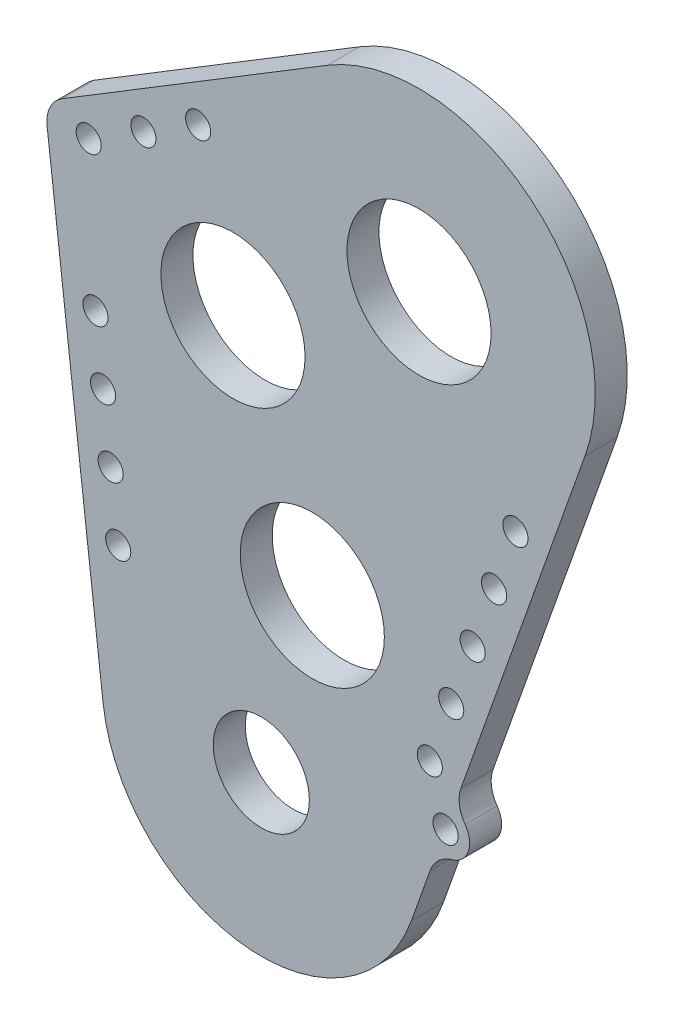
ISO-10303-21;
HEADER;
FILE_DESCRIPTION(('STEP AP214'),'2;1');
FILE_NAME('part.step','',(''),(''),'','','');
FILE_SCHEMA(('AUTOMOTIVE_DESIGN { 1 0 10303 214 1 1 1 1 }'));
ENDSEC;
DATA;
#1=APPLICATION_CONTEXT('core data for automotive mechanical design processes');
#2=APPLICATION_PROTOCOL_DEFINITION('international standard','automotive_design',2000,#1);
#3=PRODUCT_CONTEXT('',#1,'mechanical');
#4=PRODUCT('Part','Part','',(#3));
#5=PRODUCT_RELATED_PRODUCT_CATEGORY('part','',(#4));
#6=PRODUCT_DEFINITION_FORMATION('','',#4);
#7=PRODUCT_DEFINITION_CONTEXT('part definition',#1,'design');
#8=PRODUCT_DEFINITION('design','',#6,#7);
#9=PRODUCT_DEFINITION_SHAPE('','',#8);
#10=(LENGTH_UNIT() NAMED_UNIT(*) SI_UNIT(.MILLI.,.METRE.));
#11=(NAMED_UNIT(*) PLANE_ANGLE_UNIT() SI_UNIT($,.RADIAN.));
#12=(NAMED_UNIT(*) SI_UNIT($,.STERADIAN.) SOLID_ANGLE_UNIT());
#13=UNCERTAINTY_MEASURE_WITH_UNIT(LENGTH_MEASURE(1.E-05),#10,'distance_accuracy_value','');
#14=(GEOMETRIC_REPRESENTATION_CONTEXT(3) GLOBAL_UNCERTAINTY_ASSIGNED_CONTEXT((#13)) GLOBAL_UNIT_ASSIGNED_CONTEXT((#10,
#11,#12)) REPRESENTATION_CONTEXT('',''));
#15=CARTESIAN_POINT('',(0.,0.,0.));
#16=DIRECTION('',(0.,0.,1.));
#17=DIRECTION('',(1.,0.,0.));
#18=AXIS2_PLACEMENT_3D('',#15,#16,#17);
#19=CARTESIAN_POINT('',(287.62346504403,-102.053490711195,3.175));
#20=DIRECTION('',(0.942434404347901,-0.334391078680961,0.));
#21=DIRECTION('',(0.334391078680961,0.942434404347901,0.));
#22=AXIS2_PLACEMENT_3D('',#19,#20,#21);
#23=PLANE('',#22);
#24=DIRECTION('',(-0.334391078680961,-0.942434404347901,0.));
#25=VECTOR('',#24,1.);
#26=CARTESIAN_POINT('',(287.62346504403,-102.053490711195,3.175));
#27=LINE('',#26,#25);
#28=CARTESIAN_POINT('',(400.649449824626,216.494411531632,3.175));
#29=VERTEX_POINT('',#28);
#30=CARTESIAN_POINT('',(376.047742347887,147.157945908088,3.175));
#31=VERTEX_POINT('',#30);
#32=EDGE_CURVE('E123',#29,#31,#27,.T.);
#33=ORIENTED_EDGE('',*,*,#32,.T.);
#34=DIRECTION('',(0.,0.,-1.));
#35=VECTOR('',#34,1.);
#36=CARTESIAN_POINT('',(376.047742347887,147.157945908087,3.175));
#37=LINE('',#36,#35);
#38=CARTESIAN_POINT('',(376.047742347887,147.157945908088,-3.175));
#39=VERTEX_POINT('',#38);
#40=EDGE_CURVE('E293',#31,#39,#37,.T.);
#41=ORIENTED_EDGE('',*,*,#40,.T.);
#42=DIRECTION('',(-0.334391078680961,-0.942434404347901,0.));
#43=VECTOR('',#42,1.);
#44=CARTESIAN_POINT('',(287.62346504403,-102.053490711195,-3.175));
#45=LINE('',#44,#43);
#46=CARTESIAN_POINT('',(400.649449824626,216.494411531632,-3.175));
#47=VERTEX_POINT('',#46);
#48=EDGE_CURVE('E126',#47,#39,#45,.T.);
#49=ORIENTED_EDGE('',*,*,#48,.F.);
#50=DIRECTION('',(0.,0.,-1.));
#51=VECTOR('',#50,1.);
#52=CARTESIAN_POINT('',(400.649449824626,216.494411531632,3.175));
#53=LINE('',#52,#51);
#54=EDGE_CURVE('E119',#29,#47,#53,.T.);
#55=ORIENTED_EDGE('',*,*,#54,.F.);
#56=EDGE_LOOP('',(#33,#41,#49,#55));
#57=FACE_BOUND('',#56,.T.);
#58=ADVANCED_FACE('F41',(#57),#23,.T.);
#59=CARTESIAN_POINT('',(367.734928252776,228.173019954564,3.175));
#60=DIRECTION('',(0.,0.,-1.));
#61=DIRECTION('',(-1.,0.,0.));
#62=AXIS2_PLACEMENT_3D('',#59,#60,#61);
#63=CYLINDRICAL_SURFACE('',#62,34.925);
#64=CARTESIAN_POINT('',(367.734928252776,228.173019954564,-3.175));
#65=DIRECTION('',(0.,0.,1.));
#66=DIRECTION('',(1.,0.,0.));
#67=AXIS2_PLACEMENT_3D('',#64,#65,#66);
#68=CIRCLE('',#67,34.925);
#69=CARTESIAN_POINT('',(349.565627555219,257.999721702524,-3.175));
#70=VERTEX_POINT('',#69);
#71=EDGE_CURVE('E216',#47,#70,#68,.T.);
#72=ORIENTED_EDGE('',*,*,#71,.T.);
#73=DIRECTION('',(0.,0.,-1.));
#74=VECTOR('',#73,1.);
#75=CARTESIAN_POINT('',(349.565627555219,257.999721702524,3.175));
#76=LINE('',#75,#74);
#77=CARTESIAN_POINT('',(349.565627555219,257.999721702524,3.175));
#78=VERTEX_POINT('',#77);
#79=EDGE_CURVE('E131',#78,#70,#76,.T.);
#80=ORIENTED_EDGE('',*,*,#79,.F.);
#81=CARTESIAN_POINT('',(367.734928252776,228.173019954564,3.175));
#82=DIRECTION('',(0.,0.,1.));
#83=DIRECTION('',(1.,0.,0.));
#84=AXIS2_PLACEMENT_3D('',#81,#82,#83);
#85=CIRCLE('',#84,34.925);
#86=EDGE_CURVE('E135',#29,#78,#85,.T.);
#87=ORIENTED_EDGE('',*,*,#86,.F.);
#88=ORIENTED_EDGE('',*,*,#54,.T.);
#89=EDGE_LOOP('',(#72,#80,#87,#88));
#90=FACE_BOUND('',#89,.T.);
#91=ADVANCED_FACE('F136',(#90),#63,.T.);
#92=CARTESIAN_POINT('',(-20.0188014767539,32.8628399594408,3.175));
#93=DIRECTION('',(0.520237672084658,-0.854021524637369,0.));
#94=DIRECTION('',(0.854021524637369,0.520237672084658,0.));
#95=AXIS2_PLACEMENT_3D('',#92,#93,#94);
#96=PLANE('',#95);
#97=DIRECTION('',(-0.854021524637369,-0.520237672084658,0.));
#98=VECTOR('',#97,1.);
#99=CARTESIAN_POINT('',(-20.0188014767539,32.8628399594408,-3.175));
#100=LINE('',#99,#98);
#101=CARTESIAN_POINT('',(297.016905662501,225.989024126606,-3.175));
#102=VERTEX_POINT('',#101);
#103=EDGE_CURVE('E219',#70,#102,#100,.T.);
#104=ORIENTED_EDGE('',*,*,#103,.T.);
#105=DIRECTION('',(0.,0.,-1.));
#106=VECTOR('',#105,1.);
#107=CARTESIAN_POINT('',(297.016905662501,225.989024126605,3.175));
#108=LINE('',#107,#106);
#109=CARTESIAN_POINT('',(297.016905662501,225.989024126606,3.175));
#110=VERTEX_POINT('',#109);
#111=EDGE_CURVE('E283',#102,#110,#108,.F.);
#112=ORIENTED_EDGE('',*,*,#111,.T.);
#113=DIRECTION('',(-0.854021524637369,-0.520237672084658,0.));
#114=VECTOR('',#113,1.);
#115=CARTESIAN_POINT('',(-20.0188014767539,32.8628399594408,3.175));
#116=LINE('',#115,#114);
#117=EDGE_CURVE('E139',#78,#110,#116,.T.);
#118=ORIENTED_EDGE('',*,*,#117,.F.);
#119=ORIENTED_EDGE('',*,*,#79,.T.);
#120=EDGE_LOOP('',(#104,#112,#118,#119));
#121=FACE_BOUND('',#120,.T.);
#122=ADVANCED_FACE('F320',(#121),#96,.F.);
#123=CARTESIAN_POINT('',(315.649720343859,37.4460731620922,3.175));
#124=DIRECTION('',(0.993036669198225,0.11780566042298,0.));
#125=DIRECTION('',(-0.11780566042298,0.993036669198225,0.));
#126=AXIS2_PLACEMENT_3D('',#123,#124,#125);
#127=PLANE('',#126);
#128=DIRECTION('',(0.11780566042298,-0.993036669198225,0.));
#129=VECTOR('',#128,1.);
#130=CARTESIAN_POINT('',(315.649720343859,37.4460731620922,3.175));
#131=LINE('',#130,#129);
#132=CARTESIAN_POINT('',(294.014632030829,219.817921501472,3.175));
#133=VERTEX_POINT('',#132);
#134=CARTESIAN_POINT('',(305.102322432315,126.354813651986,3.175));
#135=VERTEX_POINT('',#134);
#136=EDGE_CURVE('E157',#133,#135,#131,.T.);
#137=ORIENTED_EDGE('',*,*,#136,.F.);
#138=DIRECTION('',(0.,0.,-1.));
#139=VECTOR('',#138,1.);
#140=CARTESIAN_POINT('',(294.014632030829,219.817921501472,3.175));
#141=LINE('',#140,#139);
#142=CARTESIAN_POINT('',(294.014632030829,219.817921501472,-3.175));
#143=VERTEX_POINT('',#142);
#144=EDGE_CURVE('E130',#133,#143,#141,.T.);
#145=ORIENTED_EDGE('',*,*,#144,.T.);
#146=DIRECTION('',(0.11780566042298,-0.993036669198225,0.));
#147=VECTOR('',#146,1.);
#148=CARTESIAN_POINT('',(315.649720343859,37.4460731620922,-3.175));
#149=LINE('',#148,#147);
#150=CARTESIAN_POINT('',(305.102322432315,126.354813651986,-3.175));
#151=VERTEX_POINT('',#150);
#152=EDGE_CURVE('E222',#143,#151,#149,.T.);
#153=ORIENTED_EDGE('',*,*,#152,.T.);
#154=DIRECTION('',(0.,0.,-1.));
#155=VECTOR('',#154,1.);
#156=CARTESIAN_POINT('',(305.102322432315,126.354813651986,3.175));
#157=LINE('',#156,#155);
#158=EDGE_CURVE('E275',#135,#151,#157,.T.);
#159=ORIENTED_EDGE('',*,*,#158,.F.);
#160=EDGE_LOOP('',(#137,#145,#153,#159));
#161=FACE_BOUND('',#160,.T.);
#162=ADVANCED_FACE('F336',(#161),#127,.F.);
#163=CARTESIAN_POINT('',(336.469868165004,130.075999944,3.175));
#164=DIRECTION('',(0.,0.,-1.));
#165=DIRECTION('',(-1.,0.,0.));
#166=AXIS2_PLACEMENT_3D('',#163,#164,#165);
#167=CYLINDRICAL_SURFACE('',#166,31.587499944);
#168=CARTESIAN_POINT('',(336.469868165004,130.075999944,-3.175));
#169=DIRECTION('',(0.,0.,1.));
#170=DIRECTION('',(1.,0.,0.));
#171=AXIS2_PLACEMENT_3D('',#168,#169,#170);
#172=CIRCLE('',#171,31.587499944);
#173=CARTESIAN_POINT('',(366.239014859567,119.513421764891,-3.175));
#174=VERTEX_POINT('',#173);
#175=EDGE_CURVE('E224',#151,#174,#172,.T.);
#176=ORIENTED_EDGE('',*,*,#175,.T.);
#177=DIRECTION('',(0.,0.,-1.));
#178=VECTOR('',#177,1.);
#179=CARTESIAN_POINT('',(366.239014859567,119.513421764891,3.175));
#180=LINE('',#179,#178);
#181=CARTESIAN_POINT('',(366.239014859567,119.513421764891,3.175));
#182=VERTEX_POINT('',#181);
#183=EDGE_CURVE('E208',#182,#174,#180,.T.);
#184=ORIENTED_EDGE('',*,*,#183,.F.);
#185=CARTESIAN_POINT('',(336.469868165004,130.075999944,3.175));
#186=DIRECTION('',(0.,0.,1.));
#187=DIRECTION('',(1.,0.,0.));
#188=AXIS2_PLACEMENT_3D('',#185,#186,#187);
#189=CIRCLE('',#188,31.587499944);
#190=EDGE_CURVE('E151',#135,#182,#189,.T.);
#191=ORIENTED_EDGE('',*,*,#190,.F.);
#192=ORIENTED_EDGE('',*,*,#158,.T.);
#193=EDGE_LOOP('',(#176,#184,#191,#192));
#194=FACE_BOUND('',#193,.T.);
#195=ADVANCED_FACE('F326',(#194),#167,.T.);
#196=CARTESIAN_POINT('',(369.948788010621,129.968897621695,-3.175));
#197=VERTEX_POINT('',#196);
#198=EDGE_CURVE('E217',#197,#174,#45,.T.);
#199=ORIENTED_EDGE('',*,*,#198,.F.);
#200=DIRECTION('',(0.,0.,-1.));
#201=VECTOR('',#200,1.);
#202=CARTESIAN_POINT('',(369.948788010621,129.968897621695,3.175));
#203=LINE('',#202,#201);
#204=CARTESIAN_POINT('',(369.948788010621,129.968897621695,3.175));
#205=VERTEX_POINT('',#204);
#206=EDGE_CURVE('E291',#197,#205,#203,.F.);
#207=ORIENTED_EDGE('',*,*,#206,.T.);
#208=EDGE_CURVE('E146',#205,#182,#27,.T.);
#209=ORIENTED_EDGE('',*,*,#208,.T.);
#210=ORIENTED_EDGE('',*,*,#183,.T.);
#211=EDGE_LOOP('',(#199,#207,#209,#210));
#212=FACE_BOUND('',#211,.T.);
#213=ADVANCED_FACE('F314',(#212),#23,.T.);
#214=CARTESIAN_POINT('',(378.364227579134,172.676376043099,3.175));
#215=DIRECTION('',(0.,0.,-1.));
#216=DIRECTION('',(-1.,0.,0.));
#217=AXIS2_PLACEMENT_3D('',#214,#215,#216);
#218=CYLINDRICAL_SURFACE('',#217,2.48920000000001);
#219=CARTESIAN_POINT('',(378.364227579134,172.676376043099,3.175));
#220=DIRECTION('',(0.,0.,1.));
#221=DIRECTION('',(1.,0.,0.));
#222=AXIS2_PLACEMENT_3D('',#219,#220,#221);
#223=CIRCLE('',#222,2.48920000000001);
#224=CARTESIAN_POINT('',(380.853427579134,172.676376043099,3.175));
#225=VERTEX_POINT('',#224);
#226=EDGE_CURVE('E202',#225,#225,#223,.T.);
#227=ORIENTED_EDGE('',*,*,#226,.T.);
#228=EDGE_LOOP('',(#227));
#229=FACE_BOUND('',#228,.T.);
#230=CARTESIAN_POINT('',(378.364227579134,172.676376043099,-3.175));
#231=DIRECTION('',(0.,0.,1.));
#232=DIRECTION('',(1.,0.,0.));
#233=AXIS2_PLACEMENT_3D('',#230,#231,#232);
#234=CIRCLE('',#233,2.48920000000001);
#235=CARTESIAN_POINT('',(380.853427579134,172.676376043099,-3.175));
#236=VERTEX_POINT('',#235);
#237=EDGE_CURVE('E268',#236,#236,#234,.T.);
#238=ORIENTED_EDGE('',*,*,#237,.F.);
#239=EDGE_LOOP('',(#238));
#240=FACE_BOUND('',#239,.T.);
#241=ADVANCED_FACE('F325',(#229,#240),#218,.F.);
#242=CARTESIAN_POINT('',(374.117460879886,160.70745910788,3.175));
#243=DIRECTION('',(0.,0.,-1.));
#244=DIRECTION('',(-1.,0.,0.));
#245=AXIS2_PLACEMENT_3D('',#242,#243,#244);
#246=CYLINDRICAL_SURFACE('',#245,2.48920000000001);
#247=CARTESIAN_POINT('',(374.117460879886,160.70745910788,3.175));
#248=DIRECTION('',(0.,0.,1.));
#249=DIRECTION('',(1.,0.,0.));
#250=AXIS2_PLACEMENT_3D('',#247,#248,#249);
#251=CIRCLE('',#250,2.48920000000001);
#252=CARTESIAN_POINT('',(376.606660879886,160.70745910788,3.175));
#253=VERTEX_POINT('',#252);
#254=EDGE_CURVE('E199',#253,#253,#251,.T.);
#255=ORIENTED_EDGE('',*,*,#254,.T.);
#256=EDGE_LOOP('',(#255));
#257=FACE_BOUND('',#256,.T.);
#258=CARTESIAN_POINT('',(374.117460879886,160.70745910788,-3.175));
#259=DIRECTION('',(0.,0.,1.));
#260=DIRECTION('',(1.,0.,0.));
#261=AXIS2_PLACEMENT_3D('',#258,#259,#260);
#262=CIRCLE('',#261,2.48920000000001);
#263=CARTESIAN_POINT('',(376.606660879886,160.70745910788,-3.175));
#264=VERTEX_POINT('',#263);
#265=EDGE_CURVE('E265',#264,#264,#262,.T.);
#266=ORIENTED_EDGE('',*,*,#265,.F.);
#267=EDGE_LOOP('',(#266));
#268=FACE_BOUND('',#267,.T.);
#269=ADVANCED_FACE('F332',(#257,#268),#246,.F.);
#270=CARTESIAN_POINT('',(369.870694180638,148.738542172662,3.175));
#271=DIRECTION('',(0.,0.,-1.));
#272=DIRECTION('',(-1.,0.,0.));
#273=AXIS2_PLACEMENT_3D('',#270,#271,#272);
#274=CYLINDRICAL_SURFACE('',#273,2.48920000000001);
#275=CARTESIAN_POINT('',(369.870694180638,148.738542172662,3.175));
#276=DIRECTION('',(0.,0.,1.));
#277=DIRECTION('',(1.,0.,0.));
#278=AXIS2_PLACEMENT_3D('',#275,#276,#277);
#279=CIRCLE('',#278,2.48920000000001);
#280=CARTESIAN_POINT('',(372.359894180638,148.738542172662,3.175));
#281=VERTEX_POINT('',#280);
#282=EDGE_CURVE('E196',#281,#281,#279,.T.);
#283=ORIENTED_EDGE('',*,*,#282,.T.);
#284=EDGE_LOOP('',(#283));
#285=FACE_BOUND('',#284,.T.);
#286=CARTESIAN_POINT('',(369.870694180638,148.738542172662,-3.175));
#287=DIRECTION('',(0.,0.,1.));
#288=DIRECTION('',(1.,0.,0.));
#289=AXIS2_PLACEMENT_3D('',#286,#287,#288);
#290=CIRCLE('',#289,2.48920000000001);
#291=CARTESIAN_POINT('',(372.359894180638,148.738542172662,-3.175));
#292=VERTEX_POINT('',#291);
#293=EDGE_CURVE('E262',#292,#292,#290,.T.);
#294=ORIENTED_EDGE('',*,*,#293,.F.);
#295=EDGE_LOOP('',(#294));
#296=FACE_BOUND('',#295,.T.);
#297=ADVANCED_FACE('F380',(#285,#296),#274,.F.);
#298=CARTESIAN_POINT('',(303.604354912124,192.884186253249,3.175));
#299=DIRECTION('',(0.,0.,-1.));
#300=DIRECTION('',(-1.,0.,0.));
#301=AXIS2_PLACEMENT_3D('',#298,#299,#300);
#302=CYLINDRICAL_SURFACE('',#301,2.48920000000001);
#303=CARTESIAN_POINT('',(303.604354912124,192.884186253249,3.175));
#304=DIRECTION('',(0.,0.,1.));
#305=DIRECTION('',(1.,0.,0.));
#306=AXIS2_PLACEMENT_3D('',#303,#304,#305);
#307=CIRCLE('',#306,2.48920000000001);
#308=CARTESIAN_POINT('',(306.093554912124,192.884186253249,3.175));
#309=VERTEX_POINT('',#308);
#310=EDGE_CURVE('E193',#309,#309,#307,.T.);
#311=ORIENTED_EDGE('',*,*,#310,.T.);
#312=EDGE_LOOP('',(#311));
#313=FACE_BOUND('',#312,.T.);
#314=CARTESIAN_POINT('',(303.604354912124,192.884186253249,-3.175));
#315=DIRECTION('',(0.,0.,1.));
#316=DIRECTION('',(1.,0.,0.));
#317=AXIS2_PLACEMENT_3D('',#314,#315,#316);
#318=CIRCLE('',#317,2.48920000000001);
#319=CARTESIAN_POINT('',(306.093554912124,192.884186253249,-3.175));
#320=VERTEX_POINT('',#319);
#321=EDGE_CURVE('E259',#320,#320,#318,.T.);
#322=ORIENTED_EDGE('',*,*,#321,.F.);
#323=EDGE_LOOP('',(#322));
#324=FACE_BOUND('',#323,.T.);
#325=ADVANCED_FACE('F384',(#313,#324),#302,.F.);
#326=CARTESIAN_POINT('',(313.106842155941,228.354996232748,3.175));
#327=DIRECTION('',(0.,0.,-1.));
#328=DIRECTION('',(-1.,0.,0.));
#329=AXIS2_PLACEMENT_3D('',#326,#327,#328);
#330=CYLINDRICAL_SURFACE('',#329,2.48920000000001);
#331=CARTESIAN_POINT('',(313.106842155941,228.354996232748,3.175));
#332=DIRECTION('',(0.,0.,1.));
#333=DIRECTION('',(1.,0.,0.));
#334=AXIS2_PLACEMENT_3D('',#331,#332,#333);
#335=CIRCLE('',#334,2.48920000000001);
#336=CARTESIAN_POINT('',(315.596042155941,228.354996232748,3.175));
#337=VERTEX_POINT('',#336);
#338=EDGE_CURVE('E190',#337,#337,#335,.T.);
#339=ORIENTED_EDGE('',*,*,#338,.T.);
#340=EDGE_LOOP('',(#339));
#341=FACE_BOUND('',#340,.T.);
#342=CARTESIAN_POINT('',(313.106842155941,228.354996232748,-3.175));
#343=DIRECTION('',(0.,0.,1.));
#344=DIRECTION('',(1.,0.,0.));
#345=AXIS2_PLACEMENT_3D('',#342,#343,#344);
#346=CIRCLE('',#345,2.48920000000001);
#347=CARTESIAN_POINT('',(315.596042155941,228.354996232748,-3.175));
#348=VERTEX_POINT('',#347);
#349=EDGE_CURVE('E256',#348,#348,#346,.T.);
#350=ORIENTED_EDGE('',*,*,#349,.F.);
#351=EDGE_LOOP('',(#350));
#352=FACE_BOUND('',#351,.T.);
#353=ADVANCED_FACE('F388',(#341,#352),#330,.F.);
#354=CARTESIAN_POINT('',(323.952915518835,234.962014668223,3.175));
#355=DIRECTION('',(0.,0.,-1.));
#356=DIRECTION('',(-1.,0.,0.));
#357=AXIS2_PLACEMENT_3D('',#354,#355,#356);
#358=CYLINDRICAL_SURFACE('',#357,2.48920000000001);
#359=CARTESIAN_POINT('',(323.952915518835,234.962014668223,3.175));
#360=DIRECTION('',(0.,0.,1.));
#361=DIRECTION('',(1.,0.,0.));
#362=AXIS2_PLACEMENT_3D('',#359,#360,#361);
#363=CIRCLE('',#362,2.48920000000001);
#364=CARTESIAN_POINT('',(326.442115518835,234.962014668223,3.175));
#365=VERTEX_POINT('',#364);
#366=EDGE_CURVE('E187',#365,#365,#363,.T.);
#367=ORIENTED_EDGE('',*,*,#366,.T.);
#368=EDGE_LOOP('',(#367));
#369=FACE_BOUND('',#368,.T.);
#370=CARTESIAN_POINT('',(323.952915518835,234.962014668223,-3.175));
#371=DIRECTION('',(0.,0.,1.));
#372=DIRECTION('',(1.,0.,0.));
#373=AXIS2_PLACEMENT_3D('',#370,#371,#372);
#374=CIRCLE('',#373,2.48920000000001);
#375=CARTESIAN_POINT('',(326.442115518835,234.962014668223,-3.175));
#376=VERTEX_POINT('',#375);
#377=EDGE_CURVE('E253',#376,#376,#374,.T.);
#378=ORIENTED_EDGE('',*,*,#377,.F.);
#379=EDGE_LOOP('',(#378));
#380=FACE_BOUND('',#379,.T.);
#381=ADVANCED_FACE('F392',(#369,#380),#358,.F.);
#382=CARTESIAN_POINT('',(336.469868165004,130.075999944,3.175));
#383=DIRECTION('',(0.,0.,-1.));
#384=DIRECTION('',(-1.,0.,0.));
#385=AXIS2_PLACEMENT_3D('',#382,#383,#384);
#386=CYLINDRICAL_SURFACE('',#385,9.52500000000002);
#387=CARTESIAN_POINT('',(336.469868165004,130.075999944,3.175));
#388=DIRECTION('',(0.,0.,1.));
#389=DIRECTION('',(1.,0.,0.));
#390=AXIS2_PLACEMENT_3D('',#387,#388,#389);
#391=CIRCLE('',#390,9.52500000000002);
#392=CARTESIAN_POINT('',(345.994868165004,130.075999944,3.175));
#393=VERTEX_POINT('',#392);
#394=EDGE_CURVE('E184',#393,#393,#391,.T.);
#395=ORIENTED_EDGE('',*,*,#394,.T.);
#396=EDGE_LOOP('',(#395));
#397=FACE_BOUND('',#396,.T.);
#398=CARTESIAN_POINT('',(336.469868165004,130.075999944,-3.175));
#399=DIRECTION('',(0.,0.,1.));
#400=DIRECTION('',(1.,0.,0.));
#401=AXIS2_PLACEMENT_3D('',#398,#399,#400);
#402=CIRCLE('',#401,9.52500000000002);
#403=CARTESIAN_POINT('',(345.994868165004,130.075999944,-3.175));
#404=VERTEX_POINT('',#403);
#405=EDGE_CURVE('E250',#404,#404,#402,.T.);
#406=ORIENTED_EDGE('',*,*,#405,.F.);
#407=EDGE_LOOP('',(#406));
#408=FACE_BOUND('',#407,.T.);
#409=ADVANCED_FACE('F396',(#397,#408),#386,.F.);
#410=CARTESIAN_POINT('',(308.11349073412,154.874661060992,3.175));
#411=DIRECTION('',(0.,0.,-1.));
#412=DIRECTION('',(-1.,0.,0.));
#413=AXIS2_PLACEMENT_3D('',#410,#411,#412);
#414=CYLINDRICAL_SURFACE('',#413,2.48920000000001);
#415=CARTESIAN_POINT('',(308.11349073412,154.874661060992,3.175));
#416=DIRECTION('',(0.,0.,1.));
#417=DIRECTION('',(1.,0.,0.));
#418=AXIS2_PLACEMENT_3D('',#415,#416,#417);
#419=CIRCLE('',#418,2.48920000000001);
#420=CARTESIAN_POINT('',(310.60269073412,154.874661060992,3.175));
#421=VERTEX_POINT('',#420);
#422=EDGE_CURVE('E181',#421,#421,#419,.T.);
#423=ORIENTED_EDGE('',*,*,#422,.T.);
#424=EDGE_LOOP('',(#423));
#425=FACE_BOUND('',#424,.T.);
#426=CARTESIAN_POINT('',(308.11349073412,154.874661060992,-3.175));
#427=DIRECTION('',(0.,0.,1.));
#428=DIRECTION('',(1.,0.,0.));
#429=AXIS2_PLACEMENT_3D('',#426,#427,#428);
#430=CIRCLE('',#429,2.48920000000001);
#431=CARTESIAN_POINT('',(310.60269073412,154.874661060992,-3.175));
#432=VERTEX_POINT('',#431);
#433=EDGE_CURVE('E247',#432,#432,#430,.T.);
#434=ORIENTED_EDGE('',*,*,#433,.F.);
#435=EDGE_LOOP('',(#434));
#436=FACE_BOUND('',#435,.T.);
#437=ADVANCED_FACE('F400',(#425,#436),#414,.F.);
#438=CARTESIAN_POINT('',(306.610445460121,167.544502791744,3.175));
#439=DIRECTION('',(0.,0.,-1.));
#440=DIRECTION('',(-1.,0.,0.));
#441=AXIS2_PLACEMENT_3D('',#438,#439,#440);
#442=CYLINDRICAL_SURFACE('',#441,2.48920000000001);
#443=CARTESIAN_POINT('',(306.610445460121,167.544502791744,3.175));
#444=DIRECTION('',(0.,0.,1.));
#445=DIRECTION('',(1.,0.,0.));
#446=AXIS2_PLACEMENT_3D('',#443,#444,#445);
#447=CIRCLE('',#446,2.48920000000001);
#448=CARTESIAN_POINT('',(309.099645460121,167.544502791744,3.175));
#449=VERTEX_POINT('',#448);
#450=EDGE_CURVE('E178',#449,#449,#447,.T.);
#451=ORIENTED_EDGE('',*,*,#450,.T.);
#452=EDGE_LOOP('',(#451));
#453=FACE_BOUND('',#452,.T.);
#454=CARTESIAN_POINT('',(306.610445460121,167.544502791744,-3.175));
#455=DIRECTION('',(0.,0.,1.));
#456=DIRECTION('',(1.,0.,0.));
#457=AXIS2_PLACEMENT_3D('',#454,#455,#456);
#458=CIRCLE('',#457,2.48920000000001);
#459=CARTESIAN_POINT('',(309.099645460121,167.544502791744,-3.175));
#460=VERTEX_POINT('',#459);
#461=EDGE_CURVE('E244',#460,#460,#458,.T.);
#462=ORIENTED_EDGE('',*,*,#461,.F.);
#463=EDGE_LOOP('',(#462));
#464=FACE_BOUND('',#463,.T.);
#465=ADVANCED_FACE('F404',(#453,#464),#442,.F.);
#466=CARTESIAN_POINT('',(305.107400186123,180.214344522497,3.175));
#467=DIRECTION('',(0.,0.,-1.));
#468=DIRECTION('',(-1.,0.,0.));
#469=AXIS2_PLACEMENT_3D('',#466,#467,#468);
#470=CYLINDRICAL_SURFACE('',#469,2.48920000000001);
#471=CARTESIAN_POINT('',(305.107400186123,180.214344522497,3.175));
#472=DIRECTION('',(0.,0.,1.));
#473=DIRECTION('',(1.,0.,0.));
#474=AXIS2_PLACEMENT_3D('',#471,#472,#473);
#475=CIRCLE('',#474,2.48920000000001);
#476=CARTESIAN_POINT('',(307.596600186123,180.214344522497,3.175));
#477=VERTEX_POINT('',#476);
#478=EDGE_CURVE('E175',#477,#477,#475,.T.);
#479=ORIENTED_EDGE('',*,*,#478,.T.);
#480=EDGE_LOOP('',(#479));
#481=FACE_BOUND('',#480,.T.);
#482=CARTESIAN_POINT('',(305.107400186123,180.214344522497,-3.175));
#483=DIRECTION('',(0.,0.,1.));
#484=DIRECTION('',(1.,0.,0.));
#485=AXIS2_PLACEMENT_3D('',#482,#483,#484);
#486=CIRCLE('',#485,2.48920000000001);
#487=CARTESIAN_POINT('',(307.596600186123,180.214344522497,-3.175));
#488=VERTEX_POINT('',#487);
#489=EDGE_CURVE('E241',#488,#488,#486,.T.);
#490=ORIENTED_EDGE('',*,*,#489,.F.);
#491=EDGE_LOOP('',(#490));
#492=FACE_BOUND('',#491,.T.);
#493=ADVANCED_FACE('F408',(#481,#492),#470,.F.);
#494=CARTESIAN_POINT('',(330.858278818934,205.709157273949,3.175));
#495=DIRECTION('',(0.,0.,-1.));
#496=DIRECTION('',(-1.,0.,0.));
#497=AXIS2_PLACEMENT_3D('',#494,#495,#496);
#498=CYLINDRICAL_SURFACE('',#497,14.2875);
#499=CARTESIAN_POINT('',(330.858278818934,205.709157273949,3.175));
#500=DIRECTION('',(0.,0.,1.));
#501=DIRECTION('',(1.,0.,0.));
#502=AXIS2_PLACEMENT_3D('',#499,#500,#501);
#503=CIRCLE('',#502,14.2875);
#504=CARTESIAN_POINT('',(345.145778818935,205.709157273949,3.175));
#505=VERTEX_POINT('',#504);
#506=EDGE_CURVE('E172',#505,#505,#503,.T.);
#507=ORIENTED_EDGE('',*,*,#506,.T.);
#508=EDGE_LOOP('',(#507));
#509=FACE_BOUND('',#508,.T.);
#510=CARTESIAN_POINT('',(330.858278818934,205.709157273949,-3.175));
#511=DIRECTION('',(0.,0.,1.));
#512=DIRECTION('',(1.,0.,0.));
#513=AXIS2_PLACEMENT_3D('',#510,#511,#512);
#514=CIRCLE('',#513,14.2875);
#515=CARTESIAN_POINT('',(345.145778818935,205.709157273949,-3.175));
#516=VERTEX_POINT('',#515);
#517=EDGE_CURVE('E238',#516,#516,#514,.T.);
#518=ORIENTED_EDGE('',*,*,#517,.F.);
#519=EDGE_LOOP('',(#518));
#520=FACE_BOUND('',#519,.T.);
#521=ADVANCED_FACE('F412',(#509,#520),#498,.F.);
#522=CARTESIAN_POINT('',(346.577301976758,165.491938188539,3.175));
#523=DIRECTION('',(0.,0.,-1.));
#524=DIRECTION('',(-1.,0.,0.));
#525=AXIS2_PLACEMENT_3D('',#522,#523,#524);
#526=CYLINDRICAL_SURFACE('',#525,14.2875);
#527=CARTESIAN_POINT('',(346.577301976758,165.491938188539,3.175));
#528=DIRECTION('',(0.,0.,1.));
#529=DIRECTION('',(1.,0.,0.));
#530=AXIS2_PLACEMENT_3D('',#527,#528,#529);
#531=CIRCLE('',#530,14.2875);
#532=CARTESIAN_POINT('',(360.864801976758,165.491938188539,3.175));
#533=VERTEX_POINT('',#532);
#534=EDGE_CURVE('E169',#533,#533,#531,.T.);
#535=ORIENTED_EDGE('',*,*,#534,.T.);
#536=EDGE_LOOP('',(#535));
#537=FACE_BOUND('',#536,.T.);
#538=CARTESIAN_POINT('',(346.577301976758,165.491938188539,-3.175));
#539=DIRECTION('',(0.,0.,1.));
#540=DIRECTION('',(1.,0.,0.));
#541=AXIS2_PLACEMENT_3D('',#538,#539,#540);
#542=CIRCLE('',#541,14.2875);
#543=CARTESIAN_POINT('',(360.864801976758,165.491938188539,-3.175));
#544=VERTEX_POINT('',#543);
#545=EDGE_CURVE('E235',#544,#544,#542,.T.);
#546=ORIENTED_EDGE('',*,*,#545,.F.);
#547=EDGE_LOOP('',(#546));
#548=FACE_BOUND('',#547,.T.);
#549=ADVANCED_FACE('F416',(#537,#548),#526,.F.);
#550=CARTESIAN_POINT('',(302.260768793046,221.747977797273,3.175));
#551=DIRECTION('',(0.,0.,-1.));
#552=DIRECTION('',(-1.,0.,0.));
#553=AXIS2_PLACEMENT_3D('',#550,#551,#552);
#554=CYLINDRICAL_SURFACE('',#553,2.48920000000003);
#555=CARTESIAN_POINT('',(302.260768793046,221.747977797273,3.175));
#556=DIRECTION('',(0.,0.,1.));
#557=DIRECTION('',(1.,0.,0.));
#558=AXIS2_PLACEMENT_3D('',#555,#556,#557);
#559=CIRCLE('',#558,2.48920000000003);
#560=CARTESIAN_POINT('',(304.749968793046,221.747977797273,3.175));
#561=VERTEX_POINT('',#560);
#562=EDGE_CURVE('E166',#561,#561,#559,.T.);
#563=ORIENTED_EDGE('',*,*,#562,.T.);
#564=EDGE_LOOP('',(#563));
#565=FACE_BOUND('',#564,.T.);
#566=CARTESIAN_POINT('',(302.260768793046,221.747977797273,-3.175));
#567=DIRECTION('',(0.,0.,1.));
#568=DIRECTION('',(1.,0.,0.));
#569=AXIS2_PLACEMENT_3D('',#566,#567,#568);
#570=CIRCLE('',#569,2.48920000000003);
#571=CARTESIAN_POINT('',(304.749968793046,221.747977797273,-3.175));
#572=VERTEX_POINT('',#571);
#573=EDGE_CURVE('E232',#572,#572,#570,.T.);
#574=ORIENTED_EDGE('',*,*,#573,.F.);
#575=EDGE_LOOP('',(#574));
#576=FACE_BOUND('',#575,.T.);
#577=ADVANCED_FACE('F420',(#565,#576),#554,.F.);
#578=CARTESIAN_POINT('',(386.85776097763,196.614209913535,3.175));
#579=DIRECTION('',(0.,0.,-1.));
#580=DIRECTION('',(-1.,0.,0.));
#581=AXIS2_PLACEMENT_3D('',#578,#579,#580);
#582=CYLINDRICAL_SURFACE('',#581,2.48920000000006);
#583=CARTESIAN_POINT('',(386.85776097763,196.614209913535,3.175));
#584=DIRECTION('',(0.,0.,1.));
#585=DIRECTION('',(1.,0.,0.));
#586=AXIS2_PLACEMENT_3D('',#583,#584,#585);
#587=CIRCLE('',#586,2.48920000000006);
#588=CARTESIAN_POINT('',(389.34696097763,196.614209913535,3.175));
#589=VERTEX_POINT('',#588);
#590=EDGE_CURVE('E155',#589,#589,#587,.T.);
#591=ORIENTED_EDGE('',*,*,#590,.T.);
#592=EDGE_LOOP('',(#591));
#593=FACE_BOUND('',#592,.T.);
#594=CARTESIAN_POINT('',(386.85776097763,196.614209913535,-3.175));
#595=DIRECTION('',(0.,0.,1.));
#596=DIRECTION('',(1.,0.,0.));
#597=AXIS2_PLACEMENT_3D('',#594,#595,#596);
#598=CIRCLE('',#597,2.48920000000006);
#599=CARTESIAN_POINT('',(389.34696097763,196.614209913535,-3.175));
#600=VERTEX_POINT('',#599);
#601=EDGE_CURVE('E229',#600,#600,#598,.T.);
#602=ORIENTED_EDGE('',*,*,#601,.F.);
#603=EDGE_LOOP('',(#602));
#604=FACE_BOUND('',#603,.T.);
#605=ADVANCED_FACE('F424',(#593,#604),#582,.F.);
#606=CARTESIAN_POINT('',(372.998265179254,138.563421764891,3.175));
#607=DIRECTION('',(0.,0.,-1.));
#608=DIRECTION('',(-1.,0.,0.));
#609=AXIS2_PLACEMENT_3D('',#606,#607,#608);
#610=CYLINDRICAL_SURFACE('',#609,4.76250000000001);
#611=CARTESIAN_POINT('',(372.998265179254,138.563421764891,3.175));
#612=DIRECTION('',(0.,0.,1.));
#613=DIRECTION('',(1.,0.,0.));
#614=AXIS2_PLACEMENT_3D('',#611,#612,#613);
#615=CIRCLE('',#614,4.76250000000001);
#616=CARTESIAN_POINT('',(374.256114307387,133.970032839397,3.175));
#617=VERTEX_POINT('',#616);
#618=CARTESIAN_POINT('',(376.869951880501,141.336767819279,3.175));
#619=VERTEX_POINT('',#618);
#620=EDGE_CURVE('E150',#617,#619,#615,.T.);
#621=ORIENTED_EDGE('',*,*,#620,.F.);
#622=DIRECTION('',(0.,0.,-1.));
#623=VECTOR('',#622,1.);
#624=CARTESIAN_POINT('',(374.256114307387,133.970032839397,3.175));
#625=LINE('',#624,#623);
#626=CARTESIAN_POINT('',(374.256114307387,133.970032839397,-3.175));
#627=VERTEX_POINT('',#626);
#628=EDGE_CURVE('E288',#617,#627,#625,.T.);
#629=ORIENTED_EDGE('',*,*,#628,.T.);
#630=CARTESIAN_POINT('',(372.998265179254,138.563421764891,-3.175));
#631=DIRECTION('',(0.,0.,1.));
#632=DIRECTION('',(1.,0.,0.));
#633=AXIS2_PLACEMENT_3D('',#630,#631,#632);
#634=CIRCLE('',#633,4.76250000000001);
#635=CARTESIAN_POINT('',(376.869951880501,141.336767819279,-3.175));
#636=VERTEX_POINT('',#635);
#637=EDGE_CURVE('E227',#627,#636,#634,.T.);
#638=ORIENTED_EDGE('',*,*,#637,.T.);
#639=DIRECTION('',(0.,0.,-1.));
#640=VECTOR('',#639,1.);
#641=CARTESIAN_POINT('',(376.869951880501,141.336767819279,3.175));
#642=LINE('',#641,#640);
#643=EDGE_CURVE('E56',#636,#619,#642,.F.);
#644=ORIENTED_EDGE('',*,*,#643,.T.);
#645=EDGE_LOOP('',(#621,#629,#638,#644));
#646=FACE_BOUND('',#645,.T.);
#647=ADVANCED_FACE('F303',(#646),#610,.T.);
#648=CARTESIAN_POINT('',(367.734928252776,228.173019954564,3.175));
#649=DIRECTION('',(0.,0.,-1.));
#650=DIRECTION('',(-1.,0.,0.));
#651=AXIS2_PLACEMENT_3D('',#648,#649,#650);
#652=CYLINDRICAL_SURFACE('',#651,14.2875);
#653=CARTESIAN_POINT('',(367.734928252776,228.173019954564,3.175));
#654=DIRECTION('',(0.,0.,1.));
#655=DIRECTION('',(1.,0.,0.));
#656=AXIS2_PLACEMENT_3D('',#653,#654,#655);
#657=CIRCLE('',#656,14.2875);
#658=CARTESIAN_POINT('',(382.022428252776,228.173019954564,3.175));
#659=VERTEX_POINT('',#658);
#660=EDGE_CURVE('E144',#659,#659,#657,.T.);
#661=ORIENTED_EDGE('',*,*,#660,.T.);
#662=EDGE_LOOP('',(#661));
#663=FACE_BOUND('',#662,.T.);
#664=CARTESIAN_POINT('',(367.734928252776,228.173019954564,-3.175));
#665=DIRECTION('',(0.,0.,1.));
#666=DIRECTION('',(1.,0.,0.));
#667=AXIS2_PLACEMENT_3D('',#664,#665,#666);
#668=CIRCLE('',#667,14.2875);
#669=CARTESIAN_POINT('',(382.022428252776,228.173019954564,-3.175));
#670=VERTEX_POINT('',#669);
#671=EDGE_CURVE('E212',#670,#670,#668,.T.);
#672=ORIENTED_EDGE('',*,*,#671,.F.);
#673=EDGE_LOOP('',(#672));
#674=FACE_BOUND('',#673,.T.);
#675=ADVANCED_FACE('F354',(#663,#674),#652,.F.);
#676=CARTESIAN_POINT('',(372.998265179254,138.563421764891,3.175));
#677=DIRECTION('',(0.,0.,-1.));
#678=DIRECTION('',(-1.,0.,0.));
#679=AXIS2_PLACEMENT_3D('',#676,#677,#678);
#680=CYLINDRICAL_SURFACE('',#679,2.48920000000001);
#681=CARTESIAN_POINT('',(372.998265179254,138.563421764891,3.175));
#682=DIRECTION('',(0.,0.,1.));
#683=DIRECTION('',(1.,0.,0.));
#684=AXIS2_PLACEMENT_3D('',#681,#682,#683);
#685=CIRCLE('',#684,2.48920000000001);
#686=CARTESIAN_POINT('',(375.487465179254,138.563421764891,3.175));
#687=VERTEX_POINT('',#686);
#688=EDGE_CURVE('E148',#687,#687,#685,.T.);
#689=ORIENTED_EDGE('',*,*,#688,.T.);
#690=EDGE_LOOP('',(#689));
#691=FACE_BOUND('',#690,.T.);
#692=CARTESIAN_POINT('',(372.998265179254,138.563421764891,-3.175));
#693=DIRECTION('',(0.,0.,1.));
#694=DIRECTION('',(1.,0.,0.));
#695=AXIS2_PLACEMENT_3D('',#692,#693,#694);
#696=CIRCLE('',#695,2.48920000000001);
#697=CARTESIAN_POINT('',(375.487465179254,138.563421764891,-3.175));
#698=VERTEX_POINT('',#697);
#699=EDGE_CURVE('E209',#698,#698,#696,.T.);
#700=ORIENTED_EDGE('',*,*,#699,.F.);
#701=EDGE_LOOP('',(#700));
#702=FACE_BOUND('',#701,.T.);
#703=ADVANCED_FACE('F357',(#691,#702),#680,.F.);
#704=CARTESIAN_POINT('',(382.610994278382,184.645292978317,3.175));
#705=DIRECTION('',(0.,0.,-1.));
#706=DIRECTION('',(-1.,0.,0.));
#707=AXIS2_PLACEMENT_3D('',#704,#705,#706);
#708=CYLINDRICAL_SURFACE('',#707,2.48920000000001);
#709=CARTESIAN_POINT('',(382.610994278382,184.645292978317,3.175));
#710=DIRECTION('',(0.,0.,1.));
#711=DIRECTION('',(1.,0.,0.));
#712=AXIS2_PLACEMENT_3D('',#709,#710,#711);
#713=CIRCLE('',#712,2.48920000000001);
#714=CARTESIAN_POINT('',(385.100194278382,184.645292978317,3.175));
#715=VERTEX_POINT('',#714);
#716=EDGE_CURVE('E205',#715,#715,#713,.T.);
#717=ORIENTED_EDGE('',*,*,#716,.T.);
#718=EDGE_LOOP('',(#717));
#719=FACE_BOUND('',#718,.T.);
#720=CARTESIAN_POINT('',(382.610994278382,184.645292978317,-3.175));
#721=DIRECTION('',(0.,0.,1.));
#722=DIRECTION('',(1.,0.,0.));
#723=AXIS2_PLACEMENT_3D('',#720,#721,#722);
#724=CIRCLE('',#723,2.48920000000001);
#725=CARTESIAN_POINT('',(385.100194278382,184.645292978317,-3.175));
#726=VERTEX_POINT('',#725);
#727=EDGE_CURVE('E271',#726,#726,#724,.T.);
#728=ORIENTED_EDGE('',*,*,#727,.F.);
#729=EDGE_LOOP('',(#728));
#730=FACE_BOUND('',#729,.T.);
#731=ADVANCED_FACE('F361',(#719,#730),#708,.F.);
#732=CARTESIAN_POINT('',(0.,0.,3.175));
#733=DIRECTION('',(0.,0.,1.));
#734=DIRECTION('',(1.,0.,0.));
#735=AXIS2_PLACEMENT_3D('',#732,#733,#734);
#736=PLANE('',#735);
#737=ORIENTED_EDGE('',*,*,#688,.F.);
#738=EDGE_LOOP('',(#737));
#739=FACE_BOUND('',#738,.T.);
#740=ORIENTED_EDGE('',*,*,#660,.F.);
#741=EDGE_LOOP('',(#740));
#742=FACE_BOUND('',#741,.T.);
#743=ORIENTED_EDGE('',*,*,#117,.T.);
#744=CARTESIAN_POINT('',(300.320414880238,220.565987445158,3.175));
#745=DIRECTION('',(0.,0.,1.));
#746=DIRECTION('',(1.,0.,0.));
#747=AXIS2_PLACEMENT_3D('',#744,#745,#746);
#748=CIRCLE('',#747,6.35);
#749=EDGE_CURVE('E285',#110,#133,#748,.T.);
#750=ORIENTED_EDGE('',*,*,#749,.T.);
#751=ORIENTED_EDGE('',*,*,#136,.T.);
#752=ORIENTED_EDGE('',*,*,#190,.T.);
#753=ORIENTED_EDGE('',*,*,#208,.F.);
#754=CARTESIAN_POINT('',(375.93324647823,127.845514272071,3.175));
#755=DIRECTION('',(0.,0.,1.));
#756=DIRECTION('',(1.,0.,0.));
#757=AXIS2_PLACEMENT_3D('',#754,#755,#756);
#758=CIRCLE('',#757,6.35);
#759=EDGE_CURVE('E63',#205,#617,#758,.F.);
#760=ORIENTED_EDGE('',*,*,#759,.T.);
#761=ORIENTED_EDGE('',*,*,#620,.T.);
#762=CARTESIAN_POINT('',(382.032200815496,145.034562558463,3.175));
#763=DIRECTION('',(0.,0.,1.));
#764=DIRECTION('',(1.,0.,0.));
#765=AXIS2_PLACEMENT_3D('',#762,#763,#764);
#766=CIRCLE('',#765,6.35);
#767=EDGE_CURVE('E11',#619,#31,#766,.F.);
#768=ORIENTED_EDGE('',*,*,#767,.T.);
#769=ORIENTED_EDGE('',*,*,#32,.F.);
#770=ORIENTED_EDGE('',*,*,#86,.T.);
#771=EDGE_LOOP('',(#743,#750,#751,#752,#753,#760,#761,#768,#769,#770));
#772=FACE_BOUND('',#771,.T.);
#773=ORIENTED_EDGE('',*,*,#590,.F.);
#774=EDGE_LOOP('',(#773));
#775=FACE_BOUND('',#774,.T.);
#776=ORIENTED_EDGE('',*,*,#562,.F.);
#777=EDGE_LOOP('',(#776));
#778=FACE_BOUND('',#777,.T.);
#779=ORIENTED_EDGE('',*,*,#534,.F.);
#780=EDGE_LOOP('',(#779));
#781=FACE_BOUND('',#780,.T.);
#782=ORIENTED_EDGE('',*,*,#506,.F.);
#783=EDGE_LOOP('',(#782));
#784=FACE_BOUND('',#783,.T.);
#785=ORIENTED_EDGE('',*,*,#478,.F.);
#786=EDGE_LOOP('',(#785));
#787=FACE_BOUND('',#786,.T.);
#788=ORIENTED_EDGE('',*,*,#450,.F.);
#789=EDGE_LOOP('',(#788));
#790=FACE_BOUND('',#789,.T.);
#791=ORIENTED_EDGE('',*,*,#422,.F.);
#792=EDGE_LOOP('',(#791));
#793=FACE_BOUND('',#792,.T.);
#794=ORIENTED_EDGE('',*,*,#394,.F.);
#795=EDGE_LOOP('',(#794));
#796=FACE_BOUND('',#795,.T.);
#797=ORIENTED_EDGE('',*,*,#366,.F.);
#798=EDGE_LOOP('',(#797));
#799=FACE_BOUND('',#798,.T.);
#800=ORIENTED_EDGE('',*,*,#338,.F.);
#801=EDGE_LOOP('',(#800));
#802=FACE_BOUND('',#801,.T.);
#803=ORIENTED_EDGE('',*,*,#310,.F.);
#804=EDGE_LOOP('',(#803));
#805=FACE_BOUND('',#804,.T.);
#806=ORIENTED_EDGE('',*,*,#282,.F.);
#807=EDGE_LOOP('',(#806));
#808=FACE_BOUND('',#807,.T.);
#809=ORIENTED_EDGE('',*,*,#254,.F.);
#810=EDGE_LOOP('',(#809));
#811=FACE_BOUND('',#810,.T.);
#812=ORIENTED_EDGE('',*,*,#226,.F.);
#813=EDGE_LOOP('',(#812));
#814=FACE_BOUND('',#813,.T.);
#815=ORIENTED_EDGE('',*,*,#716,.F.);
#816=EDGE_LOOP('',(#815));
#817=FACE_BOUND('',#816,.T.);
#818=ADVANCED_FACE('F141',(#739,#742,#772,#775,#778,#781,#784,#787,#790,#793,#796,#799,#802,
#805,#808,#811,#814,#817),#736,.T.);
#819=CARTESIAN_POINT('',(0.,0.,-3.175));
#820=DIRECTION('',(0.,0.,1.));
#821=DIRECTION('',(1.,0.,0.));
#822=AXIS2_PLACEMENT_3D('',#819,#820,#821);
#823=PLANE('',#822);
#824=ORIENTED_EDGE('',*,*,#699,.T.);
#825=EDGE_LOOP('',(#824));
#826=FACE_BOUND('',#825,.T.);
#827=ORIENTED_EDGE('',*,*,#671,.T.);
#828=EDGE_LOOP('',(#827));
#829=FACE_BOUND('',#828,.T.);
#830=ORIENTED_EDGE('',*,*,#152,.F.);
#831=CARTESIAN_POINT('',(300.320414880238,220.565987445158,-3.175));
#832=DIRECTION('',(0.,0.,1.));
#833=DIRECTION('',(1.,0.,0.));
#834=AXIS2_PLACEMENT_3D('',#831,#832,#833);
#835=CIRCLE('',#834,6.35);
#836=EDGE_CURVE('E281',#143,#102,#835,.F.);
#837=ORIENTED_EDGE('',*,*,#836,.T.);
#838=ORIENTED_EDGE('',*,*,#103,.F.);
#839=ORIENTED_EDGE('',*,*,#71,.F.);
#840=ORIENTED_EDGE('',*,*,#48,.T.);
#841=CARTESIAN_POINT('',(382.032200815496,145.034562558463,-3.175));
#842=DIRECTION('',(0.,0.,1.));
#843=DIRECTION('',(1.,0.,0.));
#844=AXIS2_PLACEMENT_3D('',#841,#842,#843);
#845=CIRCLE('',#844,6.35);
#846=EDGE_CURVE('E49',#39,#636,#845,.T.);
#847=ORIENTED_EDGE('',*,*,#846,.T.);
#848=ORIENTED_EDGE('',*,*,#637,.F.);
#849=CARTESIAN_POINT('',(375.93324647823,127.845514272071,-3.175));
#850=DIRECTION('',(0.,0.,1.));
#851=DIRECTION('',(1.,0.,0.));
#852=AXIS2_PLACEMENT_3D('',#849,#850,#851);
#853=CIRCLE('',#852,6.35);
#854=EDGE_CURVE('E295',#627,#197,#853,.T.);
#855=ORIENTED_EDGE('',*,*,#854,.T.);
#856=ORIENTED_EDGE('',*,*,#198,.T.);
#857=ORIENTED_EDGE('',*,*,#175,.F.);
#858=EDGE_LOOP('',(#830,#837,#838,#839,#840,#847,#848,#855,#856,#857));
#859=FACE_BOUND('',#858,.T.);
#860=ORIENTED_EDGE('',*,*,#601,.T.);
#861=EDGE_LOOP('',(#860));
#862=FACE_BOUND('',#861,.T.);
#863=ORIENTED_EDGE('',*,*,#573,.T.);
#864=EDGE_LOOP('',(#863));
#865=FACE_BOUND('',#864,.T.);
#866=ORIENTED_EDGE('',*,*,#545,.T.);
#867=EDGE_LOOP('',(#866));
#868=FACE_BOUND('',#867,.T.);
#869=ORIENTED_EDGE('',*,*,#517,.T.);
#870=EDGE_LOOP('',(#869));
#871=FACE_BOUND('',#870,.T.);
#872=ORIENTED_EDGE('',*,*,#489,.T.);
#873=EDGE_LOOP('',(#872));
#874=FACE_BOUND('',#873,.T.);
#875=ORIENTED_EDGE('',*,*,#461,.T.);
#876=EDGE_LOOP('',(#875));
#877=FACE_BOUND('',#876,.T.);
#878=ORIENTED_EDGE('',*,*,#433,.T.);
#879=EDGE_LOOP('',(#878));
#880=FACE_BOUND('',#879,.T.);
#881=ORIENTED_EDGE('',*,*,#405,.T.);
#882=EDGE_LOOP('',(#881));
#883=FACE_BOUND('',#882,.T.);
#884=ORIENTED_EDGE('',*,*,#377,.T.);
#885=EDGE_LOOP('',(#884));
#886=FACE_BOUND('',#885,.T.);
#887=ORIENTED_EDGE('',*,*,#349,.T.);
#888=EDGE_LOOP('',(#887));
#889=FACE_BOUND('',#888,.T.);
#890=ORIENTED_EDGE('',*,*,#321,.T.);
#891=EDGE_LOOP('',(#890));
#892=FACE_BOUND('',#891,.T.);
#893=ORIENTED_EDGE('',*,*,#293,.T.);
#894=EDGE_LOOP('',(#893));
#895=FACE_BOUND('',#894,.T.);
#896=ORIENTED_EDGE('',*,*,#265,.T.);
#897=EDGE_LOOP('',(#896));
#898=FACE_BOUND('',#897,.T.);
#899=ORIENTED_EDGE('',*,*,#237,.T.);
#900=EDGE_LOOP('',(#899));
#901=FACE_BOUND('',#900,.T.);
#902=ORIENTED_EDGE('',*,*,#727,.T.);
#903=EDGE_LOOP('',(#902));
#904=FACE_BOUND('',#903,.T.);
#905=ADVANCED_FACE('F300',(#826,#829,#859,#862,#865,#868,#871,#874,#877,#880,#883,#886,#889,
#892,#895,#898,#901,#904),#823,.F.);
#906=CARTESIAN_POINT('',(300.320414880238,220.565987445158,3.175));
#907=DIRECTION('',(0.,0.,-1.));
#908=DIRECTION('',(-1.,0.,0.));
#909=AXIS2_PLACEMENT_3D('',#906,#907,#908);
#910=CYLINDRICAL_SURFACE('',#909,6.35);
#911=ORIENTED_EDGE('',*,*,#749,.F.);
#912=ORIENTED_EDGE('',*,*,#111,.F.);
#913=ORIENTED_EDGE('',*,*,#836,.F.);
#914=ORIENTED_EDGE('',*,*,#144,.F.);
#915=EDGE_LOOP('',(#911,#912,#913,#914));
#916=FACE_BOUND('',#915,.T.);
#917=ADVANCED_FACE('F310',(#916),#910,.T.);
#918=CARTESIAN_POINT('',(375.93324647823,127.845514272071,3.175));
#919=DIRECTION('',(0.,0.,-1.));
#920=DIRECTION('',(-1.,0.,0.));
#921=AXIS2_PLACEMENT_3D('',#918,#919,#920);
#922=CYLINDRICAL_SURFACE('',#921,6.35);
#923=ORIENTED_EDGE('',*,*,#759,.F.);
#924=ORIENTED_EDGE('',*,*,#206,.F.);
#925=ORIENTED_EDGE('',*,*,#854,.F.);
#926=ORIENTED_EDGE('',*,*,#628,.F.);
#927=EDGE_LOOP('',(#923,#924,#925,#926));
#928=FACE_BOUND('',#927,.T.);
#929=ADVANCED_FACE('F306',(#928),#922,.F.);
#930=CARTESIAN_POINT('',(382.032200815496,145.034562558463,3.175));
#931=DIRECTION('',(0.,0.,-1.));
#932=DIRECTION('',(-1.,0.,0.));
#933=AXIS2_PLACEMENT_3D('',#930,#931,#932);
#934=CYLINDRICAL_SURFACE('',#933,6.35);
#935=ORIENTED_EDGE('',*,*,#767,.F.);
#936=ORIENTED_EDGE('',*,*,#643,.F.);
#937=ORIENTED_EDGE('',*,*,#846,.F.);
#938=ORIENTED_EDGE('',*,*,#40,.F.);
#939=EDGE_LOOP('',(#935,#936,#937,#938));
#940=FACE_BOUND('',#939,.T.);
#941=ADVANCED_FACE('F43',(#940),#934,.F.);
#942=CLOSED_SHELL('',(#58,#91,#122,#162,#195,#213,#241,#269,#297,#325,#353,#381,#409,#437,#465,
#493,#521,#549,#577,#605,#647,#675,#703,#731,#818,#905,#917,#929,#941));
#943=MANIFOLD_SOLID_BREP('B2',#942);
#944=ADVANCED_BREP_SHAPE_REPRESENTATION('',(#18,#943),#14);
#945=SHAPE_DEFINITION_REPRESENTATION(#9,#944);
ENDSEC;
END-ISO-10303-21;
